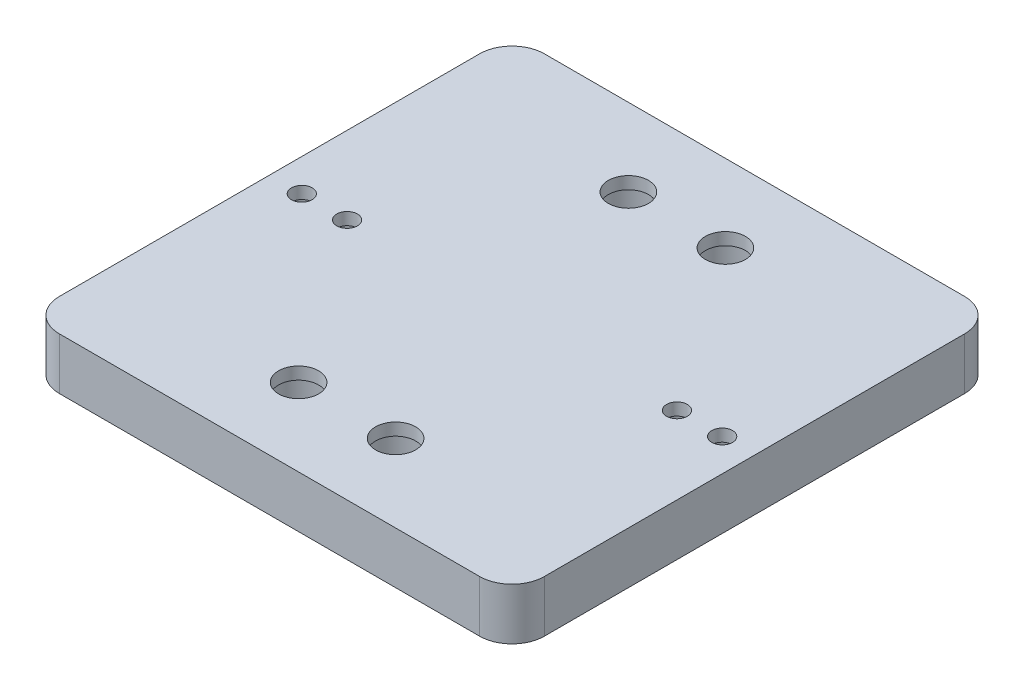
ISO-10303-21;
HEADER;
FILE_DESCRIPTION(('STEP AP214'),'2;1');
FILE_NAME('part.step','',(''),(''),'','','');
FILE_SCHEMA(('AUTOMOTIVE_DESIGN { 1 0 10303 214 1 1 1 1 }'));
ENDSEC;
DATA;
#1=APPLICATION_CONTEXT('core data for automotive mechanical design processes');
#2=APPLICATION_PROTOCOL_DEFINITION('international standard','automotive_design',2000,#1);
#3=PRODUCT_CONTEXT('',#1,'mechanical');
#4=PRODUCT('Part','Part','',(#3));
#5=PRODUCT_RELATED_PRODUCT_CATEGORY('part','',(#4));
#6=PRODUCT_DEFINITION_FORMATION('','',#4);
#7=PRODUCT_DEFINITION_CONTEXT('part definition',#1,'design');
#8=PRODUCT_DEFINITION('design','',#6,#7);
#9=PRODUCT_DEFINITION_SHAPE('','',#8);
#10=(LENGTH_UNIT() NAMED_UNIT(*) SI_UNIT(.MILLI.,.METRE.));
#11=(NAMED_UNIT(*) PLANE_ANGLE_UNIT() SI_UNIT($,.RADIAN.));
#12=(NAMED_UNIT(*) SI_UNIT($,.STERADIAN.) SOLID_ANGLE_UNIT());
#13=UNCERTAINTY_MEASURE_WITH_UNIT(LENGTH_MEASURE(1.E-05),#10,'distance_accuracy_value','');
#14=(GEOMETRIC_REPRESENTATION_CONTEXT(3) GLOBAL_UNCERTAINTY_ASSIGNED_CONTEXT((#13)) GLOBAL_UNIT_ASSIGNED_CONTEXT((#10,
#11,#12)) REPRESENTATION_CONTEXT('',''));
#15=CARTESIAN_POINT('',(0.,0.,0.));
#16=DIRECTION('',(0.,0.,1.));
#17=DIRECTION('',(1.,0.,0.));
#18=AXIS2_PLACEMENT_3D('',#15,#16,#17);
#19=CARTESIAN_POINT('',(-25.5,4.,0.));
#20=DIRECTION('',(0.,-1.,0.));
#21=DIRECTION('',(0.,0.,-1.));
#22=AXIS2_PLACEMENT_3D('',#19,#20,#21);
#23=CYLINDRICAL_SURFACE('',#22,1.6);
#24=CARTESIAN_POINT('',(-25.5,4.,0.));
#25=DIRECTION('',(0.,1.,0.));
#26=DIRECTION('',(0.,0.,-1.));
#27=AXIS2_PLACEMENT_3D('',#24,#25,#26);
#28=CIRCLE('',#27,1.6);
#29=CARTESIAN_POINT('',(-25.5,4.,-1.6));
#30=VERTEX_POINT('',#29);
#31=EDGE_CURVE('E192',#30,#30,#28,.T.);
#32=ORIENTED_EDGE('',*,*,#31,.T.);
#33=EDGE_LOOP('',(#32));
#34=FACE_BOUND('',#33,.T.);
#35=CARTESIAN_POINT('',(-25.5,2.1,0.));
#36=DIRECTION('',(0.,-1.,0.));
#37=DIRECTION('',(0.,0.,-1.));
#38=AXIS2_PLACEMENT_3D('',#35,#36,#37);
#39=CIRCLE('',#38,1.6);
#40=CARTESIAN_POINT('',(-25.5,2.1,-1.6));
#41=VERTEX_POINT('',#40);
#42=EDGE_CURVE('E141',#41,#41,#39,.T.);
#43=ORIENTED_EDGE('',*,*,#42,.T.);
#44=EDGE_LOOP('',(#43));
#45=FACE_BOUND('',#44,.T.);
#46=ADVANCED_FACE('F39',(#34,#45),#23,.F.);
#47=CARTESIAN_POINT('',(-32.5,4.,0.));
#48=DIRECTION('',(0.,-1.,0.));
#49=DIRECTION('',(0.,0.,-1.));
#50=AXIS2_PLACEMENT_3D('',#47,#48,#49);
#51=CYLINDRICAL_SURFACE('',#50,1.60000000000001);
#52=CARTESIAN_POINT('',(-32.5,4.,0.));
#53=DIRECTION('',(0.,1.,0.));
#54=DIRECTION('',(0.,0.,1.));
#55=AXIS2_PLACEMENT_3D('',#52,#53,#54);
#56=CIRCLE('',#55,1.60000000000001);
#57=CARTESIAN_POINT('',(-32.5,4.,1.6));
#58=VERTEX_POINT('',#57);
#59=EDGE_CURVE('E230',#58,#58,#56,.T.);
#60=ORIENTED_EDGE('',*,*,#59,.T.);
#61=EDGE_LOOP('',(#60));
#62=FACE_BOUND('',#61,.T.);
#63=CARTESIAN_POINT('',(-32.5,2.1,0.));
#64=DIRECTION('',(0.,-1.,0.));
#65=DIRECTION('',(0.,0.,-1.));
#66=AXIS2_PLACEMENT_3D('',#63,#64,#65);
#67=CIRCLE('',#66,1.60000000000001);
#68=CARTESIAN_POINT('',(-32.5,2.1,-1.60000000000001));
#69=VERTEX_POINT('',#68);
#70=EDGE_CURVE('E265',#69,#69,#67,.T.);
#71=ORIENTED_EDGE('',*,*,#70,.T.);
#72=EDGE_LOOP('',(#71));
#73=FACE_BOUND('',#72,.T.);
#74=ADVANCED_FACE('F373',(#62,#73),#51,.F.);
#75=CARTESIAN_POINT('',(7.50000000000001,4.,25.5));
#76=DIRECTION('',(0.,-1.,0.));
#77=DIRECTION('',(0.,0.,-1.));
#78=AXIS2_PLACEMENT_3D('',#75,#76,#77);
#79=CYLINDRICAL_SURFACE('',#78,3.09999999999999);
#80=CARTESIAN_POINT('',(7.50000000000001,4.,25.5));
#81=DIRECTION('',(0.,1.,0.));
#82=DIRECTION('',(0.,0.,-1.));
#83=AXIS2_PLACEMENT_3D('',#80,#81,#82);
#84=CIRCLE('',#83,3.09999999999999);
#85=CARTESIAN_POINT('',(7.50000000000001,4.,22.4));
#86=VERTEX_POINT('',#85);
#87=EDGE_CURVE('E214',#86,#86,#84,.T.);
#88=ORIENTED_EDGE('',*,*,#87,.T.);
#89=EDGE_LOOP('',(#88));
#90=FACE_BOUND('',#89,.T.);
#91=CARTESIAN_POINT('',(7.50000000000001,2.1,25.5));
#92=DIRECTION('',(0.,-1.,0.));
#93=DIRECTION('',(0.,0.,-1.));
#94=AXIS2_PLACEMENT_3D('',#91,#92,#93);
#95=CIRCLE('',#94,3.09999999999999);
#96=CARTESIAN_POINT('',(7.50000000000001,2.1,22.4));
#97=VERTEX_POINT('',#96);
#98=EDGE_CURVE('E250',#97,#97,#95,.T.);
#99=ORIENTED_EDGE('',*,*,#98,.T.);
#100=EDGE_LOOP('',(#99));
#101=FACE_BOUND('',#100,.T.);
#102=ADVANCED_FACE('F379',(#90,#101),#79,.F.);
#103=CARTESIAN_POINT('',(-7.49999999999999,4.,-25.5));
#104=DIRECTION('',(0.,-1.,0.));
#105=DIRECTION('',(0.,0.,-1.));
#106=AXIS2_PLACEMENT_3D('',#103,#104,#105);
#107=CYLINDRICAL_SURFACE('',#106,3.1);
#108=CARTESIAN_POINT('',(-7.49999999999999,4.,-25.5));
#109=DIRECTION('',(0.,1.,0.));
#110=DIRECTION('',(0.,0.,-1.));
#111=AXIS2_PLACEMENT_3D('',#108,#109,#110);
#112=CIRCLE('',#111,3.1);
#113=CARTESIAN_POINT('',(-7.49999999999999,4.,-28.6));
#114=VERTEX_POINT('',#113);
#115=EDGE_CURVE('E203',#114,#114,#112,.T.);
#116=ORIENTED_EDGE('',*,*,#115,.T.);
#117=EDGE_LOOP('',(#116));
#118=FACE_BOUND('',#117,.T.);
#119=CARTESIAN_POINT('',(-7.49999999999999,2.1,-25.5));
#120=DIRECTION('',(0.,-1.,0.));
#121=DIRECTION('',(0.,0.,-1.));
#122=AXIS2_PLACEMENT_3D('',#119,#120,#121);
#123=CIRCLE('',#122,3.1);
#124=CARTESIAN_POINT('',(-7.49999999999999,2.1,-28.6));
#125=VERTEX_POINT('',#124);
#126=EDGE_CURVE('E241',#125,#125,#123,.T.);
#127=ORIENTED_EDGE('',*,*,#126,.T.);
#128=EDGE_LOOP('',(#127));
#129=FACE_BOUND('',#128,.T.);
#130=ADVANCED_FACE('F386',(#118,#129),#107,.F.);
#131=CARTESIAN_POINT('',(0.,4.,0.));
#132=DIRECTION('',(0.,1.,0.));
#133=DIRECTION('',(0.,0.,1.));
#134=AXIS2_PLACEMENT_3D('',#131,#132,#133);
#135=PLANE('',#134);
#136=CARTESIAN_POINT('',(7.50000000000001,4.,-25.5));
#137=DIRECTION('',(0.,1.,0.));
#138=DIRECTION('',(0.,0.,1.));
#139=AXIS2_PLACEMENT_3D('',#136,#137,#138);
#140=CIRCLE('',#139,3.09999999999999);
#141=CARTESIAN_POINT('',(7.50000000000001,4.,-22.4));
#142=VERTEX_POINT('',#141);
#143=EDGE_CURVE('E210',#142,#142,#140,.T.);
#144=ORIENTED_EDGE('',*,*,#143,.F.);
#145=EDGE_LOOP('',(#144));
#146=FACE_BOUND('',#145,.T.);
#147=CARTESIAN_POINT('',(-7.49999999999999,4.,25.5));
#148=DIRECTION('',(0.,1.,0.));
#149=DIRECTION('',(0.,0.,1.));
#150=AXIS2_PLACEMENT_3D('',#147,#148,#149);
#151=CIRCLE('',#150,3.1);
#152=CARTESIAN_POINT('',(-7.49999999999999,4.,28.6));
#153=VERTEX_POINT('',#152);
#154=EDGE_CURVE('E218',#153,#153,#151,.T.);
#155=ORIENTED_EDGE('',*,*,#154,.F.);
#156=EDGE_LOOP('',(#155));
#157=FACE_BOUND('',#156,.T.);
#158=CARTESIAN_POINT('',(25.5,4.,0.));
#159=DIRECTION('',(0.,1.,0.));
#160=DIRECTION('',(0.,0.,1.));
#161=AXIS2_PLACEMENT_3D('',#158,#159,#160);
#162=CIRCLE('',#161,1.60000000000001);
#163=CARTESIAN_POINT('',(25.5,4.,1.6));
#164=VERTEX_POINT('',#163);
#165=EDGE_CURVE('E226',#164,#164,#162,.T.);
#166=ORIENTED_EDGE('',*,*,#165,.F.);
#167=EDGE_LOOP('',(#166));
#168=FACE_BOUND('',#167,.T.);
#169=ORIENTED_EDGE('',*,*,#31,.F.);
#170=EDGE_LOOP('',(#169));
#171=FACE_BOUND('',#170,.T.);
#172=DIRECTION('',(1.,0.,0.));
#173=VECTOR('',#172,1.);
#174=CARTESIAN_POINT('',(-37.5,4.,37.5));
#175=LINE('',#174,#173);
#176=CARTESIAN_POINT('',(-32.5,4.,37.5));
#177=VERTEX_POINT('',#176);
#178=CARTESIAN_POINT('',(32.5,4.,37.5));
#179=VERTEX_POINT('',#178);
#180=EDGE_CURVE('E191',#177,#179,#175,.T.);
#181=ORIENTED_EDGE('',*,*,#180,.T.);
#182=CARTESIAN_POINT('',(32.5,4.,32.5));
#183=DIRECTION('',(0.,1.,0.));
#184=DIRECTION('',(0.,0.,1.));
#185=AXIS2_PLACEMENT_3D('',#182,#183,#184);
#186=CIRCLE('',#185,5.);
#187=CARTESIAN_POINT('',(37.5,4.,32.5));
#188=VERTEX_POINT('',#187);
#189=EDGE_CURVE('E165',#179,#188,#186,.T.);
#190=ORIENTED_EDGE('',*,*,#189,.T.);
#191=DIRECTION('',(0.,0.,-1.));
#192=VECTOR('',#191,1.);
#193=CARTESIAN_POINT('',(37.5,4.,-37.5));
#194=LINE('',#193,#192);
#195=CARTESIAN_POINT('',(37.5,4.,-32.5));
#196=VERTEX_POINT('',#195);
#197=EDGE_CURVE('E138',#188,#196,#194,.T.);
#198=ORIENTED_EDGE('',*,*,#197,.T.);
#199=CARTESIAN_POINT('',(32.5,4.,-32.5));
#200=DIRECTION('',(0.,1.,0.));
#201=DIRECTION('',(0.,0.,1.));
#202=AXIS2_PLACEMENT_3D('',#199,#200,#201);
#203=CIRCLE('',#202,5.);
#204=CARTESIAN_POINT('',(32.5,4.,-37.5));
#205=VERTEX_POINT('',#204);
#206=EDGE_CURVE('E62',#196,#205,#203,.T.);
#207=ORIENTED_EDGE('',*,*,#206,.T.);
#208=DIRECTION('',(-1.,0.,0.));
#209=VECTOR('',#208,1.);
#210=CARTESIAN_POINT('',(-37.5,4.,-37.5));
#211=LINE('',#210,#209);
#212=CARTESIAN_POINT('',(-32.5,4.,-37.5));
#213=VERTEX_POINT('',#212);
#214=EDGE_CURVE('E132',#205,#213,#211,.T.);
#215=ORIENTED_EDGE('',*,*,#214,.T.);
#216=CARTESIAN_POINT('',(-32.5,4.,-32.5));
#217=DIRECTION('',(0.,1.,0.));
#218=DIRECTION('',(0.,0.,1.));
#219=AXIS2_PLACEMENT_3D('',#216,#217,#218);
#220=CIRCLE('',#219,5.);
#221=CARTESIAN_POINT('',(-37.5,4.,-32.5));
#222=VERTEX_POINT('',#221);
#223=EDGE_CURVE('E160',#213,#222,#220,.T.);
#224=ORIENTED_EDGE('',*,*,#223,.T.);
#225=DIRECTION('',(0.,0.,1.));
#226=VECTOR('',#225,1.);
#227=CARTESIAN_POINT('',(-37.5,4.,-37.5));
#228=LINE('',#227,#226);
#229=CARTESIAN_POINT('',(-37.5,4.,32.5));
#230=VERTEX_POINT('',#229);
#231=EDGE_CURVE('E179',#222,#230,#228,.T.);
#232=ORIENTED_EDGE('',*,*,#231,.T.);
#233=CARTESIAN_POINT('',(-32.5,4.,32.5));
#234=DIRECTION('',(0.,1.,0.));
#235=DIRECTION('',(0.,0.,1.));
#236=AXIS2_PLACEMENT_3D('',#233,#234,#235);
#237=CIRCLE('',#236,5.);
#238=EDGE_CURVE('E157',#230,#177,#237,.T.);
#239=ORIENTED_EDGE('',*,*,#238,.T.);
#240=EDGE_LOOP('',(#181,#190,#198,#207,#215,#224,#232,#239));
#241=FACE_BOUND('',#240,.T.);
#242=ORIENTED_EDGE('',*,*,#59,.F.);
#243=EDGE_LOOP('',(#242));
#244=FACE_BOUND('',#243,.T.);
#245=CARTESIAN_POINT('',(32.5,4.,0.));
#246=DIRECTION('',(0.,1.,0.));
#247=DIRECTION('',(0.,0.,-1.));
#248=AXIS2_PLACEMENT_3D('',#245,#246,#247);
#249=CIRCLE('',#248,1.6);
#250=CARTESIAN_POINT('',(32.5,4.,-1.60000000000001));
#251=VERTEX_POINT('',#250);
#252=EDGE_CURVE('E222',#251,#251,#249,.T.);
#253=ORIENTED_EDGE('',*,*,#252,.F.);
#254=EDGE_LOOP('',(#253));
#255=FACE_BOUND('',#254,.T.);
#256=ORIENTED_EDGE('',*,*,#87,.F.);
#257=EDGE_LOOP('',(#256));
#258=FACE_BOUND('',#257,.T.);
#259=ORIENTED_EDGE('',*,*,#115,.F.);
#260=EDGE_LOOP('',(#259));
#261=FACE_BOUND('',#260,.T.);
#262=ADVANCED_FACE('F186',(#146,#157,#168,#171,#241,#244,#255,#258,#261),#135,.T.);
#263=CARTESIAN_POINT('',(-37.5,4.,-37.5));
#264=DIRECTION('',(1.,0.,0.));
#265=DIRECTION('',(0.,0.,-1.));
#266=AXIS2_PLACEMENT_3D('',#263,#264,#265);
#267=PLANE('',#266);
#268=ORIENTED_EDGE('',*,*,#231,.F.);
#269=DIRECTION('',(0.,-1.,0.));
#270=VECTOR('',#269,1.);
#271=CARTESIAN_POINT('',(-37.5,4.,-32.5));
#272=LINE('',#271,#270);
#273=CARTESIAN_POINT('',(-37.5,-4.,-32.5));
#274=VERTEX_POINT('',#273);
#275=EDGE_CURVE('E11',#222,#274,#272,.T.);
#276=ORIENTED_EDGE('',*,*,#275,.T.);
#277=DIRECTION('',(0.,0.,-1.));
#278=VECTOR('',#277,1.);
#279=CARTESIAN_POINT('',(-37.5,-4.,-37.5));
#280=LINE('',#279,#278);
#281=CARTESIAN_POINT('',(-37.5,-4.,32.5));
#282=VERTEX_POINT('',#281);
#283=EDGE_CURVE('E182',#282,#274,#280,.T.);
#284=ORIENTED_EDGE('',*,*,#283,.F.);
#285=DIRECTION('',(0.,-1.,0.));
#286=VECTOR('',#285,1.);
#287=CARTESIAN_POINT('',(-37.5,4.,32.5));
#288=LINE('',#287,#286);
#289=EDGE_CURVE('E48',#282,#230,#288,.F.);
#290=ORIENTED_EDGE('',*,*,#289,.T.);
#291=EDGE_LOOP('',(#268,#276,#284,#290));
#292=FACE_BOUND('',#291,.T.);
#293=ADVANCED_FACE('F178',(#292),#267,.F.);
#294=CARTESIAN_POINT('',(-37.5,4.,37.5));
#295=DIRECTION('',(0.,0.,-1.));
#296=DIRECTION('',(-1.,0.,0.));
#297=AXIS2_PLACEMENT_3D('',#294,#295,#296);
#298=PLANE('',#297);
#299=DIRECTION('',(-1.,0.,0.));
#300=VECTOR('',#299,1.);
#301=CARTESIAN_POINT('',(-37.5,-4.,37.5));
#302=LINE('',#301,#300);
#303=CARTESIAN_POINT('',(32.5,-4.,37.5));
#304=VERTEX_POINT('',#303);
#305=CARTESIAN_POINT('',(-32.5,-4.,37.5));
#306=VERTEX_POINT('',#305);
#307=EDGE_CURVE('E128',#304,#306,#302,.T.);
#308=ORIENTED_EDGE('',*,*,#307,.F.);
#309=DIRECTION('',(0.,-1.,0.));
#310=VECTOR('',#309,1.);
#311=CARTESIAN_POINT('',(32.5,4.,37.5));
#312=LINE('',#311,#310);
#313=EDGE_CURVE('E154',#304,#179,#312,.F.);
#314=ORIENTED_EDGE('',*,*,#313,.T.);
#315=ORIENTED_EDGE('',*,*,#180,.F.);
#316=DIRECTION('',(0.,-1.,0.));
#317=VECTOR('',#316,1.);
#318=CARTESIAN_POINT('',(-32.5,4.,37.5));
#319=LINE('',#318,#317);
#320=EDGE_CURVE('E150',#177,#306,#319,.T.);
#321=ORIENTED_EDGE('',*,*,#320,.T.);
#322=EDGE_LOOP('',(#308,#314,#315,#321));
#323=FACE_BOUND('',#322,.T.);
#324=ADVANCED_FACE('F198',(#323),#298,.F.);
#325=CARTESIAN_POINT('',(37.5,4.,-37.5));
#326=DIRECTION('',(-1.,0.,0.));
#327=DIRECTION('',(0.,0.,1.));
#328=AXIS2_PLACEMENT_3D('',#325,#326,#327);
#329=PLANE('',#328);
#330=ORIENTED_EDGE('',*,*,#197,.F.);
#331=DIRECTION('',(0.,-1.,0.));
#332=VECTOR('',#331,1.);
#333=CARTESIAN_POINT('',(37.5,4.,32.5));
#334=LINE('',#333,#332);
#335=CARTESIAN_POINT('',(37.5,-4.,32.5));
#336=VERTEX_POINT('',#335);
#337=EDGE_CURVE('E126',#188,#336,#334,.T.);
#338=ORIENTED_EDGE('',*,*,#337,.T.);
#339=DIRECTION('',(0.,0.,1.));
#340=VECTOR('',#339,1.);
#341=CARTESIAN_POINT('',(37.5,-4.,37.5));
#342=LINE('',#341,#340);
#343=CARTESIAN_POINT('',(37.5,-4.,-32.5));
#344=VERTEX_POINT('',#343);
#345=EDGE_CURVE('E110',#344,#336,#342,.T.);
#346=ORIENTED_EDGE('',*,*,#345,.F.);
#347=DIRECTION('',(0.,-1.,0.));
#348=VECTOR('',#347,1.);
#349=CARTESIAN_POINT('',(37.5,4.,-32.5));
#350=LINE('',#349,#348);
#351=EDGE_CURVE('E124',#344,#196,#350,.F.);
#352=ORIENTED_EDGE('',*,*,#351,.T.);
#353=EDGE_LOOP('',(#330,#338,#346,#352));
#354=FACE_BOUND('',#353,.T.);
#355=ADVANCED_FACE('F123',(#354),#329,.F.);
#356=CARTESIAN_POINT('',(-37.5,4.,-37.5));
#357=DIRECTION('',(0.,0.,1.));
#358=DIRECTION('',(1.,0.,0.));
#359=AXIS2_PLACEMENT_3D('',#356,#357,#358);
#360=PLANE('',#359);
#361=ORIENTED_EDGE('',*,*,#214,.F.);
#362=DIRECTION('',(0.,-1.,0.));
#363=VECTOR('',#362,1.);
#364=CARTESIAN_POINT('',(32.5,4.,-37.5));
#365=LINE('',#364,#363);
#366=CARTESIAN_POINT('',(32.5,-4.,-37.5));
#367=VERTEX_POINT('',#366);
#368=EDGE_CURVE('E170',#205,#367,#365,.T.);
#369=ORIENTED_EDGE('',*,*,#368,.T.);
#370=DIRECTION('',(1.,0.,0.));
#371=VECTOR('',#370,1.);
#372=CARTESIAN_POINT('',(37.5,-4.,-37.5));
#373=LINE('',#372,#371);
#374=CARTESIAN_POINT('',(-32.5,-4.,-37.5));
#375=VERTEX_POINT('',#374);
#376=EDGE_CURVE('E111',#375,#367,#373,.T.);
#377=ORIENTED_EDGE('',*,*,#376,.F.);
#378=DIRECTION('',(0.,-1.,0.));
#379=VECTOR('',#378,1.);
#380=CARTESIAN_POINT('',(-32.5,4.,-37.5));
#381=LINE('',#380,#379);
#382=EDGE_CURVE('E55',#375,#213,#381,.F.);
#383=ORIENTED_EDGE('',*,*,#382,.T.);
#384=EDGE_LOOP('',(#361,#369,#377,#383));
#385=FACE_BOUND('',#384,.T.);
#386=ADVANCED_FACE('F388',(#385),#360,.F.);
#387=CARTESIAN_POINT('',(25.5,4.,0.));
#388=DIRECTION('',(0.,-1.,0.));
#389=DIRECTION('',(0.,0.,-1.));
#390=AXIS2_PLACEMENT_3D('',#387,#388,#389);
#391=CYLINDRICAL_SURFACE('',#390,1.60000000000001);
#392=CARTESIAN_POINT('',(25.5,2.1,0.));
#393=DIRECTION('',(0.,1.,0.));
#394=DIRECTION('',(0.,0.,1.));
#395=AXIS2_PLACEMENT_3D('',#392,#393,#394);
#396=CIRCLE('',#395,1.60000000000001);
#397=CARTESIAN_POINT('',(25.5,2.1,1.6));
#398=VERTEX_POINT('',#397);
#399=EDGE_CURVE('E262',#398,#398,#396,.T.);
#400=ORIENTED_EDGE('',*,*,#399,.F.);
#401=EDGE_LOOP('',(#400));
#402=FACE_BOUND('',#401,.T.);
#403=ORIENTED_EDGE('',*,*,#165,.T.);
#404=EDGE_LOOP('',(#403));
#405=FACE_BOUND('',#404,.T.);
#406=ADVANCED_FACE('F391',(#402,#405),#391,.F.);
#407=CARTESIAN_POINT('',(32.5,4.,0.));
#408=DIRECTION('',(0.,-1.,0.));
#409=DIRECTION('',(0.,0.,-1.));
#410=AXIS2_PLACEMENT_3D('',#407,#408,#409);
#411=CYLINDRICAL_SURFACE('',#410,1.6);
#412=CARTESIAN_POINT('',(32.5,2.1,0.));
#413=DIRECTION('',(0.,1.,0.));
#414=DIRECTION('',(0.,0.,1.));
#415=AXIS2_PLACEMENT_3D('',#412,#413,#414);
#416=CIRCLE('',#415,1.6);
#417=CARTESIAN_POINT('',(32.5,2.1,1.59999999999999));
#418=VERTEX_POINT('',#417);
#419=EDGE_CURVE('E258',#418,#418,#416,.T.);
#420=ORIENTED_EDGE('',*,*,#419,.F.);
#421=EDGE_LOOP('',(#420));
#422=FACE_BOUND('',#421,.T.);
#423=ORIENTED_EDGE('',*,*,#252,.T.);
#424=EDGE_LOOP('',(#423));
#425=FACE_BOUND('',#424,.T.);
#426=ADVANCED_FACE('F635',(#422,#425),#411,.F.);
#427=CARTESIAN_POINT('',(-7.49999999999999,4.,25.5));
#428=DIRECTION('',(0.,-1.,0.));
#429=DIRECTION('',(0.,0.,-1.));
#430=AXIS2_PLACEMENT_3D('',#427,#428,#429);
#431=CYLINDRICAL_SURFACE('',#430,3.1);
#432=CARTESIAN_POINT('',(-7.49999999999999,2.1,25.5));
#433=DIRECTION('',(0.,1.,0.));
#434=DIRECTION('',(0.,0.,1.));
#435=AXIS2_PLACEMENT_3D('',#432,#433,#434);
#436=CIRCLE('',#435,3.1);
#437=CARTESIAN_POINT('',(-7.49999999999999,2.1,28.6));
#438=VERTEX_POINT('',#437);
#439=EDGE_CURVE('E254',#438,#438,#436,.T.);
#440=ORIENTED_EDGE('',*,*,#439,.F.);
#441=EDGE_LOOP('',(#440));
#442=FACE_BOUND('',#441,.T.);
#443=ORIENTED_EDGE('',*,*,#154,.T.);
#444=EDGE_LOOP('',(#443));
#445=FACE_BOUND('',#444,.T.);
#446=ADVANCED_FACE('F625',(#442,#445),#431,.F.);
#447=CARTESIAN_POINT('',(7.50000000000001,4.,-25.5));
#448=DIRECTION('',(0.,-1.,0.));
#449=DIRECTION('',(0.,0.,-1.));
#450=AXIS2_PLACEMENT_3D('',#447,#448,#449);
#451=CYLINDRICAL_SURFACE('',#450,3.09999999999999);
#452=CARTESIAN_POINT('',(7.50000000000001,2.1,-25.5));
#453=DIRECTION('',(0.,1.,0.));
#454=DIRECTION('',(0.,0.,1.));
#455=AXIS2_PLACEMENT_3D('',#452,#453,#454);
#456=CIRCLE('',#455,3.09999999999999);
#457=CARTESIAN_POINT('',(7.50000000000001,2.1,-22.4));
#458=VERTEX_POINT('',#457);
#459=EDGE_CURVE('E245',#458,#458,#456,.T.);
#460=ORIENTED_EDGE('',*,*,#459,.F.);
#461=EDGE_LOOP('',(#460));
#462=FACE_BOUND('',#461,.T.);
#463=ORIENTED_EDGE('',*,*,#143,.T.);
#464=EDGE_LOOP('',(#463));
#465=FACE_BOUND('',#464,.T.);
#466=ADVANCED_FACE('F352',(#462,#465),#451,.F.);
#467=CARTESIAN_POINT('',(0.,-4.,0.));
#468=DIRECTION('',(0.,1.,0.));
#469=DIRECTION('',(0.,0.,1.));
#470=AXIS2_PLACEMENT_3D('',#467,#468,#469);
#471=PLANE('',#470);
#472=CARTESIAN_POINT('',(7.49999999999998,-4.,-25.5));
#473=DIRECTION('',(0.,-1.,0.));
#474=DIRECTION('',(0.,0.,1.));
#475=AXIS2_PLACEMENT_3D('',#472,#473,#474);
#476=CIRCLE('',#475,5.05);
#477=CARTESIAN_POINT('',(7.49999999999998,-4.,-20.45));
#478=VERTEX_POINT('',#477);
#479=EDGE_CURVE('E309',#478,#478,#476,.T.);
#480=ORIENTED_EDGE('',*,*,#479,.F.);
#481=EDGE_LOOP('',(#480));
#482=FACE_BOUND('',#481,.T.);
#483=CARTESIAN_POINT('',(7.49999999999998,-4.,25.5));
#484=DIRECTION('',(0.,-1.,0.));
#485=DIRECTION('',(0.,0.,-1.));
#486=AXIS2_PLACEMENT_3D('',#483,#484,#485);
#487=CIRCLE('',#486,5.05);
#488=CARTESIAN_POINT('',(7.49999999999998,-4.,20.45));
#489=VERTEX_POINT('',#488);
#490=EDGE_CURVE('E301',#489,#489,#487,.T.);
#491=ORIENTED_EDGE('',*,*,#490,.F.);
#492=EDGE_LOOP('',(#491));
#493=FACE_BOUND('',#492,.T.);
#494=CARTESIAN_POINT('',(-7.49999999999998,-4.,25.5));
#495=DIRECTION('',(0.,-1.,0.));
#496=DIRECTION('',(0.,0.,1.));
#497=AXIS2_PLACEMENT_3D('',#494,#495,#496);
#498=CIRCLE('',#497,5.04999999999999);
#499=CARTESIAN_POINT('',(-7.49999999999998,-4.,30.55));
#500=VERTEX_POINT('',#499);
#501=EDGE_CURVE('E293',#500,#500,#498,.T.);
#502=ORIENTED_EDGE('',*,*,#501,.F.);
#503=EDGE_LOOP('',(#502));
#504=FACE_BOUND('',#503,.T.);
#505=CARTESIAN_POINT('',(-32.5,-4.,0.));
#506=DIRECTION('',(0.,-1.,0.));
#507=DIRECTION('',(0.,0.,-1.));
#508=AXIS2_PLACEMENT_3D('',#505,#506,#507);
#509=CIRCLE('',#508,2.95);
#510=CARTESIAN_POINT('',(-32.5,-4.,-2.95));
#511=VERTEX_POINT('',#510);
#512=EDGE_CURVE('E284',#511,#511,#509,.T.);
#513=ORIENTED_EDGE('',*,*,#512,.F.);
#514=EDGE_LOOP('',(#513));
#515=FACE_BOUND('',#514,.T.);
#516=CARTESIAN_POINT('',(-25.5,-4.,0.));
#517=DIRECTION('',(0.,-1.,0.));
#518=DIRECTION('',(0.,0.,-1.));
#519=AXIS2_PLACEMENT_3D('',#516,#517,#518);
#520=CIRCLE('',#519,2.95);
#521=CARTESIAN_POINT('',(-25.5,-4.,-2.95));
#522=VERTEX_POINT('',#521);
#523=EDGE_CURVE('E332',#522,#522,#520,.T.);
#524=ORIENTED_EDGE('',*,*,#523,.F.);
#525=EDGE_LOOP('',(#524));
#526=FACE_BOUND('',#525,.T.);
#527=CARTESIAN_POINT('',(25.5,-4.,0.));
#528=DIRECTION('',(0.,-1.,0.));
#529=DIRECTION('',(0.,0.,1.));
#530=AXIS2_PLACEMENT_3D('',#527,#528,#529);
#531=CIRCLE('',#530,2.95);
#532=CARTESIAN_POINT('',(25.5,-4.,2.95));
#533=VERTEX_POINT('',#532);
#534=EDGE_CURVE('E324',#533,#533,#531,.T.);
#535=ORIENTED_EDGE('',*,*,#534,.F.);
#536=EDGE_LOOP('',(#535));
#537=FACE_BOUND('',#536,.T.);
#538=CARTESIAN_POINT('',(32.5,-4.,0.));
#539=DIRECTION('',(0.,-1.,0.));
#540=DIRECTION('',(0.,0.,1.));
#541=AXIS2_PLACEMENT_3D('',#538,#539,#540);
#542=CIRCLE('',#541,2.95000000000001);
#543=CARTESIAN_POINT('',(32.5,-4.,2.95000000000001));
#544=VERTEX_POINT('',#543);
#545=EDGE_CURVE('E316',#544,#544,#542,.T.);
#546=ORIENTED_EDGE('',*,*,#545,.F.);
#547=EDGE_LOOP('',(#546));
#548=FACE_BOUND('',#547,.T.);
#549=CARTESIAN_POINT('',(-7.49999999999999,-4.,-25.5));
#550=DIRECTION('',(0.,-1.,0.));
#551=DIRECTION('',(0.,0.,-1.));
#552=AXIS2_PLACEMENT_3D('',#549,#550,#551);
#553=CIRCLE('',#552,5.05);
#554=CARTESIAN_POINT('',(-7.49999999999999,-4.,-30.55));
#555=VERTEX_POINT('',#554);
#556=EDGE_CURVE('E276',#555,#555,#553,.T.);
#557=ORIENTED_EDGE('',*,*,#556,.F.);
#558=EDGE_LOOP('',(#557));
#559=FACE_BOUND('',#558,.T.);
#560=ORIENTED_EDGE('',*,*,#345,.T.);
#561=CARTESIAN_POINT('',(32.5,-4.,32.5));
#562=DIRECTION('',(0.,1.,0.));
#563=DIRECTION('',(0.,0.,1.));
#564=AXIS2_PLACEMENT_3D('',#561,#562,#563);
#565=CIRCLE('',#564,5.);
#566=EDGE_CURVE('E117',#336,#304,#565,.F.);
#567=ORIENTED_EDGE('',*,*,#566,.T.);
#568=ORIENTED_EDGE('',*,*,#307,.T.);
#569=CARTESIAN_POINT('',(-32.5,-4.,32.5));
#570=DIRECTION('',(0.,1.,0.));
#571=DIRECTION('',(0.,0.,1.));
#572=AXIS2_PLACEMENT_3D('',#569,#570,#571);
#573=CIRCLE('',#572,5.);
#574=EDGE_CURVE('E136',#306,#282,#573,.F.);
#575=ORIENTED_EDGE('',*,*,#574,.T.);
#576=ORIENTED_EDGE('',*,*,#283,.T.);
#577=CARTESIAN_POINT('',(-32.5,-4.,-32.5));
#578=DIRECTION('',(0.,1.,0.));
#579=DIRECTION('',(0.,0.,1.));
#580=AXIS2_PLACEMENT_3D('',#577,#578,#579);
#581=CIRCLE('',#580,5.);
#582=EDGE_CURVE('E118',#274,#375,#581,.F.);
#583=ORIENTED_EDGE('',*,*,#582,.T.);
#584=ORIENTED_EDGE('',*,*,#376,.T.);
#585=CARTESIAN_POINT('',(32.5,-4.,-32.5));
#586=DIRECTION('',(0.,1.,0.));
#587=DIRECTION('',(0.,0.,1.));
#588=AXIS2_PLACEMENT_3D('',#585,#586,#587);
#589=CIRCLE('',#588,5.);
#590=EDGE_CURVE('E107',#367,#344,#589,.F.);
#591=ORIENTED_EDGE('',*,*,#590,.T.);
#592=EDGE_LOOP('',(#560,#567,#568,#575,#576,#583,#584,#591));
#593=FACE_BOUND('',#592,.T.);
#594=ADVANCED_FACE('F109',(#482,#493,#504,#515,#526,#537,#548,#559,#593),#471,.F.);
#595=CARTESIAN_POINT('',(-7.49999999999999,2.1,-25.5));
#596=DIRECTION('',(0.,-1.,0.));
#597=DIRECTION('',(0.,0.,-1.));
#598=AXIS2_PLACEMENT_3D('',#595,#596,#597);
#599=CYLINDRICAL_SURFACE('',#598,5.05);
#600=CARTESIAN_POINT('',(-7.49999999999999,2.1,-25.5));
#601=DIRECTION('',(0.,-1.,0.));
#602=DIRECTION('',(0.,0.,-1.));
#603=AXIS2_PLACEMENT_3D('',#600,#601,#602);
#604=CIRCLE('',#603,5.05);
#605=CARTESIAN_POINT('',(-7.49999999999999,2.1,-30.55));
#606=VERTEX_POINT('',#605);
#607=EDGE_CURVE('E246',#606,#606,#604,.T.);
#608=ORIENTED_EDGE('',*,*,#607,.F.);
#609=EDGE_LOOP('',(#608));
#610=FACE_BOUND('',#609,.T.);
#611=ORIENTED_EDGE('',*,*,#556,.T.);
#612=EDGE_LOOP('',(#611));
#613=FACE_BOUND('',#612,.T.);
#614=ADVANCED_FACE('F351',(#610,#613),#599,.F.);
#615=CARTESIAN_POINT('',(-7.49999999999999,2.1,-25.5));
#616=DIRECTION('',(0.,-1.,0.));
#617=DIRECTION('',(0.,0.,-1.));
#618=AXIS2_PLACEMENT_3D('',#615,#616,#617);
#619=PLANE('',#618);
#620=ORIENTED_EDGE('',*,*,#126,.F.);
#621=EDGE_LOOP('',(#620));
#622=FACE_BOUND('',#621,.T.);
#623=ORIENTED_EDGE('',*,*,#607,.T.);
#624=EDGE_LOOP('',(#623));
#625=FACE_BOUND('',#624,.T.);
#626=ADVANCED_FACE('F362',(#622,#625),#619,.T.);
#627=CARTESIAN_POINT('',(32.5,2.1,0.));
#628=DIRECTION('',(0.,-1.,0.));
#629=DIRECTION('',(0.,0.,-1.));
#630=AXIS2_PLACEMENT_3D('',#627,#628,#629);
#631=CYLINDRICAL_SURFACE('',#630,2.95000000000001);
#632=CARTESIAN_POINT('',(32.5,2.1,0.));
#633=DIRECTION('',(0.,-1.,0.));
#634=DIRECTION('',(0.,0.,1.));
#635=AXIS2_PLACEMENT_3D('',#632,#633,#634);
#636=CIRCLE('',#635,2.95000000000001);
#637=CARTESIAN_POINT('',(32.5,2.1,2.95000000000001));
#638=VERTEX_POINT('',#637);
#639=EDGE_CURVE('E320',#638,#638,#636,.T.);
#640=ORIENTED_EDGE('',*,*,#639,.F.);
#641=EDGE_LOOP('',(#640));
#642=FACE_BOUND('',#641,.T.);
#643=ORIENTED_EDGE('',*,*,#545,.T.);
#644=EDGE_LOOP('',(#643));
#645=FACE_BOUND('',#644,.T.);
#646=ADVANCED_FACE('F368',(#642,#645),#631,.F.);
#647=CARTESIAN_POINT('',(32.5,2.1,0.));
#648=DIRECTION('',(0.,1.,0.));
#649=DIRECTION('',(0.,0.,1.));
#650=AXIS2_PLACEMENT_3D('',#647,#648,#649);
#651=PLANE('',#650);
#652=ORIENTED_EDGE('',*,*,#419,.T.);
#653=EDGE_LOOP('',(#652));
#654=FACE_BOUND('',#653,.T.);
#655=ORIENTED_EDGE('',*,*,#639,.T.);
#656=EDGE_LOOP('',(#655));
#657=FACE_BOUND('',#656,.T.);
#658=ADVANCED_FACE('F588',(#654,#657),#651,.F.);
#659=CARTESIAN_POINT('',(25.5,2.1,0.));
#660=DIRECTION('',(0.,-1.,0.));
#661=DIRECTION('',(0.,0.,-1.));
#662=AXIS2_PLACEMENT_3D('',#659,#660,#661);
#663=CYLINDRICAL_SURFACE('',#662,2.95);
#664=CARTESIAN_POINT('',(25.5,2.1,0.));
#665=DIRECTION('',(0.,-1.,0.));
#666=DIRECTION('',(0.,0.,1.));
#667=AXIS2_PLACEMENT_3D('',#664,#665,#666);
#668=CIRCLE('',#667,2.95);
#669=CARTESIAN_POINT('',(25.5,2.1,2.95));
#670=VERTEX_POINT('',#669);
#671=EDGE_CURVE('E328',#670,#670,#668,.T.);
#672=ORIENTED_EDGE('',*,*,#671,.F.);
#673=EDGE_LOOP('',(#672));
#674=FACE_BOUND('',#673,.T.);
#675=ORIENTED_EDGE('',*,*,#534,.T.);
#676=EDGE_LOOP('',(#675));
#677=FACE_BOUND('',#676,.T.);
#678=ADVANCED_FACE('F578',(#674,#677),#663,.F.);
#679=CARTESIAN_POINT('',(25.5,2.1,0.));
#680=DIRECTION('',(0.,1.,0.));
#681=DIRECTION('',(0.,0.,1.));
#682=AXIS2_PLACEMENT_3D('',#679,#680,#681);
#683=PLANE('',#682);
#684=ORIENTED_EDGE('',*,*,#399,.T.);
#685=EDGE_LOOP('',(#684));
#686=FACE_BOUND('',#685,.T.);
#687=ORIENTED_EDGE('',*,*,#671,.T.);
#688=EDGE_LOOP('',(#687));
#689=FACE_BOUND('',#688,.T.);
#690=ADVANCED_FACE('F345',(#686,#689),#683,.F.);
#691=CARTESIAN_POINT('',(-25.5,2.1,0.));
#692=DIRECTION('',(0.,-1.,0.));
#693=DIRECTION('',(0.,0.,-1.));
#694=AXIS2_PLACEMENT_3D('',#691,#692,#693);
#695=CYLINDRICAL_SURFACE('',#694,2.95);
#696=CARTESIAN_POINT('',(-25.5,2.1,0.));
#697=DIRECTION('',(0.,-1.,0.));
#698=DIRECTION('',(0.,0.,-1.));
#699=AXIS2_PLACEMENT_3D('',#696,#697,#698);
#700=CIRCLE('',#699,2.95);
#701=CARTESIAN_POINT('',(-25.5,2.1,-2.95));
#702=VERTEX_POINT('',#701);
#703=EDGE_CURVE('E289',#702,#702,#700,.T.);
#704=ORIENTED_EDGE('',*,*,#703,.F.);
#705=EDGE_LOOP('',(#704));
#706=FACE_BOUND('',#705,.T.);
#707=ORIENTED_EDGE('',*,*,#523,.T.);
#708=EDGE_LOOP('',(#707));
#709=FACE_BOUND('',#708,.T.);
#710=ADVANCED_FACE('F342',(#706,#709),#695,.F.);
#711=CARTESIAN_POINT('',(-25.5,2.1,0.));
#712=DIRECTION('',(0.,-1.,0.));
#713=DIRECTION('',(0.,0.,-1.));
#714=AXIS2_PLACEMENT_3D('',#711,#712,#713);
#715=PLANE('',#714);
#716=ORIENTED_EDGE('',*,*,#42,.F.);
#717=EDGE_LOOP('',(#716));
#718=FACE_BOUND('',#717,.T.);
#719=ORIENTED_EDGE('',*,*,#703,.T.);
#720=EDGE_LOOP('',(#719));
#721=FACE_BOUND('',#720,.T.);
#722=ADVANCED_FACE('F340',(#718,#721),#715,.T.);
#723=CARTESIAN_POINT('',(-32.5,2.1,0.));
#724=DIRECTION('',(0.,-1.,0.));
#725=DIRECTION('',(0.,0.,-1.));
#726=AXIS2_PLACEMENT_3D('',#723,#724,#725);
#727=CYLINDRICAL_SURFACE('',#726,2.95);
#728=CARTESIAN_POINT('',(-32.5,2.1,0.));
#729=DIRECTION('',(0.,-1.,0.));
#730=DIRECTION('',(0.,0.,-1.));
#731=AXIS2_PLACEMENT_3D('',#728,#729,#730);
#732=CIRCLE('',#731,2.95);
#733=CARTESIAN_POINT('',(-32.5,2.1,-2.95));
#734=VERTEX_POINT('',#733);
#735=EDGE_CURVE('E288',#734,#734,#732,.T.);
#736=ORIENTED_EDGE('',*,*,#735,.F.);
#737=EDGE_LOOP('',(#736));
#738=FACE_BOUND('',#737,.T.);
#739=ORIENTED_EDGE('',*,*,#512,.T.);
#740=EDGE_LOOP('',(#739));
#741=FACE_BOUND('',#740,.T.);
#742=ADVANCED_FACE('F544',(#738,#741),#727,.F.);
#743=CARTESIAN_POINT('',(-32.5,2.1,0.));
#744=DIRECTION('',(0.,-1.,0.));
#745=DIRECTION('',(0.,0.,-1.));
#746=AXIS2_PLACEMENT_3D('',#743,#744,#745);
#747=PLANE('',#746);
#748=ORIENTED_EDGE('',*,*,#70,.F.);
#749=EDGE_LOOP('',(#748));
#750=FACE_BOUND('',#749,.T.);
#751=ORIENTED_EDGE('',*,*,#735,.T.);
#752=EDGE_LOOP('',(#751));
#753=FACE_BOUND('',#752,.T.);
#754=ADVANCED_FACE('F534',(#750,#753),#747,.T.);
#755=CARTESIAN_POINT('',(-7.49999999999998,2.1,25.5));
#756=DIRECTION('',(0.,-1.,0.));
#757=DIRECTION('',(0.,0.,-1.));
#758=AXIS2_PLACEMENT_3D('',#755,#756,#757);
#759=CYLINDRICAL_SURFACE('',#758,5.04999999999999);
#760=CARTESIAN_POINT('',(-7.49999999999998,2.1,25.5));
#761=DIRECTION('',(0.,-1.,0.));
#762=DIRECTION('',(0.,0.,1.));
#763=AXIS2_PLACEMENT_3D('',#760,#761,#762);
#764=CIRCLE('',#763,5.04999999999999);
#765=CARTESIAN_POINT('',(-7.49999999999998,2.1,30.55));
#766=VERTEX_POINT('',#765);
#767=EDGE_CURVE('E297',#766,#766,#764,.T.);
#768=ORIENTED_EDGE('',*,*,#767,.F.);
#769=EDGE_LOOP('',(#768));
#770=FACE_BOUND('',#769,.T.);
#771=ORIENTED_EDGE('',*,*,#501,.T.);
#772=EDGE_LOOP('',(#771));
#773=FACE_BOUND('',#772,.T.);
#774=ADVANCED_FACE('F524',(#770,#773),#759,.F.);
#775=CARTESIAN_POINT('',(-7.49999999999998,2.1,25.5));
#776=DIRECTION('',(0.,1.,0.));
#777=DIRECTION('',(0.,0.,1.));
#778=AXIS2_PLACEMENT_3D('',#775,#776,#777);
#779=PLANE('',#778);
#780=ORIENTED_EDGE('',*,*,#439,.T.);
#781=EDGE_LOOP('',(#780));
#782=FACE_BOUND('',#781,.T.);
#783=ORIENTED_EDGE('',*,*,#767,.T.);
#784=EDGE_LOOP('',(#783));
#785=FACE_BOUND('',#784,.T.);
#786=ADVANCED_FACE('F514',(#782,#785),#779,.F.);
#787=CARTESIAN_POINT('',(7.49999999999998,2.1,25.5));
#788=DIRECTION('',(0.,-1.,0.));
#789=DIRECTION('',(0.,0.,-1.));
#790=AXIS2_PLACEMENT_3D('',#787,#788,#789);
#791=CYLINDRICAL_SURFACE('',#790,5.05);
#792=CARTESIAN_POINT('',(7.49999999999998,2.1,25.5));
#793=DIRECTION('',(0.,-1.,0.));
#794=DIRECTION('',(0.,0.,-1.));
#795=AXIS2_PLACEMENT_3D('',#792,#793,#794);
#796=CIRCLE('',#795,5.05);
#797=CARTESIAN_POINT('',(7.49999999999998,2.1,20.45));
#798=VERTEX_POINT('',#797);
#799=EDGE_CURVE('E305',#798,#798,#796,.T.);
#800=ORIENTED_EDGE('',*,*,#799,.F.);
#801=EDGE_LOOP('',(#800));
#802=FACE_BOUND('',#801,.T.);
#803=ORIENTED_EDGE('',*,*,#490,.T.);
#804=EDGE_LOOP('',(#803));
#805=FACE_BOUND('',#804,.T.);
#806=ADVANCED_FACE('F504',(#802,#805),#791,.F.);
#807=CARTESIAN_POINT('',(7.49999999999998,2.1,25.5));
#808=DIRECTION('',(0.,-1.,0.));
#809=DIRECTION('',(0.,0.,-1.));
#810=AXIS2_PLACEMENT_3D('',#807,#808,#809);
#811=PLANE('',#810);
#812=ORIENTED_EDGE('',*,*,#98,.F.);
#813=EDGE_LOOP('',(#812));
#814=FACE_BOUND('',#813,.T.);
#815=ORIENTED_EDGE('',*,*,#799,.T.);
#816=EDGE_LOOP('',(#815));
#817=FACE_BOUND('',#816,.T.);
#818=ADVANCED_FACE('F494',(#814,#817),#811,.T.);
#819=CARTESIAN_POINT('',(7.49999999999998,2.1,-25.5));
#820=DIRECTION('',(0.,-1.,0.));
#821=DIRECTION('',(0.,0.,-1.));
#822=AXIS2_PLACEMENT_3D('',#819,#820,#821);
#823=CYLINDRICAL_SURFACE('',#822,5.05);
#824=CARTESIAN_POINT('',(7.49999999999998,2.1,-25.5));
#825=DIRECTION('',(0.,-1.,0.));
#826=DIRECTION('',(0.,0.,1.));
#827=AXIS2_PLACEMENT_3D('',#824,#825,#826);
#828=CIRCLE('',#827,5.05);
#829=CARTESIAN_POINT('',(7.49999999999998,2.1,-20.45));
#830=VERTEX_POINT('',#829);
#831=EDGE_CURVE('E280',#830,#830,#828,.T.);
#832=ORIENTED_EDGE('',*,*,#831,.F.);
#833=EDGE_LOOP('',(#832));
#834=FACE_BOUND('',#833,.T.);
#835=ORIENTED_EDGE('',*,*,#479,.T.);
#836=EDGE_LOOP('',(#835));
#837=FACE_BOUND('',#836,.T.);
#838=ADVANCED_FACE('F484',(#834,#837),#823,.F.);
#839=CARTESIAN_POINT('',(7.49999999999998,2.1,-25.5));
#840=DIRECTION('',(0.,1.,0.));
#841=DIRECTION('',(0.,0.,1.));
#842=AXIS2_PLACEMENT_3D('',#839,#840,#841);
#843=PLANE('',#842);
#844=ORIENTED_EDGE('',*,*,#459,.T.);
#845=EDGE_LOOP('',(#844));
#846=FACE_BOUND('',#845,.T.);
#847=ORIENTED_EDGE('',*,*,#831,.T.);
#848=EDGE_LOOP('',(#847));
#849=FACE_BOUND('',#848,.T.);
#850=ADVANCED_FACE('F401',(#846,#849),#843,.F.);
#851=CARTESIAN_POINT('',(32.5,4.,32.5));
#852=DIRECTION('',(0.,-1.,0.));
#853=DIRECTION('',(0.,0.,-1.));
#854=AXIS2_PLACEMENT_3D('',#851,#852,#853);
#855=CYLINDRICAL_SURFACE('',#854,5.);
#856=ORIENTED_EDGE('',*,*,#189,.F.);
#857=ORIENTED_EDGE('',*,*,#313,.F.);
#858=ORIENTED_EDGE('',*,*,#566,.F.);
#859=ORIENTED_EDGE('',*,*,#337,.F.);
#860=EDGE_LOOP('',(#856,#857,#858,#859));
#861=FACE_BOUND('',#860,.T.);
#862=ADVANCED_FACE('F398',(#861),#855,.T.);
#863=CARTESIAN_POINT('',(32.5,4.,-32.5));
#864=DIRECTION('',(0.,-1.,0.));
#865=DIRECTION('',(0.,0.,-1.));
#866=AXIS2_PLACEMENT_3D('',#863,#864,#865);
#867=CYLINDRICAL_SURFACE('',#866,5.);
#868=ORIENTED_EDGE('',*,*,#206,.F.);
#869=ORIENTED_EDGE('',*,*,#351,.F.);
#870=ORIENTED_EDGE('',*,*,#590,.F.);
#871=ORIENTED_EDGE('',*,*,#368,.F.);
#872=EDGE_LOOP('',(#868,#869,#870,#871));
#873=FACE_BOUND('',#872,.T.);
#874=ADVANCED_FACE('F130',(#873),#867,.T.);
#875=CARTESIAN_POINT('',(-32.5,4.,-32.5));
#876=DIRECTION('',(0.,-1.,0.));
#877=DIRECTION('',(0.,0.,-1.));
#878=AXIS2_PLACEMENT_3D('',#875,#876,#877);
#879=CYLINDRICAL_SURFACE('',#878,5.);
#880=ORIENTED_EDGE('',*,*,#223,.F.);
#881=ORIENTED_EDGE('',*,*,#382,.F.);
#882=ORIENTED_EDGE('',*,*,#582,.F.);
#883=ORIENTED_EDGE('',*,*,#275,.F.);
#884=EDGE_LOOP('',(#880,#881,#882,#883));
#885=FACE_BOUND('',#884,.T.);
#886=ADVANCED_FACE('F404',(#885),#879,.T.);
#887=CARTESIAN_POINT('',(-32.5,4.,32.5));
#888=DIRECTION('',(0.,-1.,0.));
#889=DIRECTION('',(0.,0.,-1.));
#890=AXIS2_PLACEMENT_3D('',#887,#888,#889);
#891=CYLINDRICAL_SURFACE('',#890,5.);
#892=ORIENTED_EDGE('',*,*,#238,.F.);
#893=ORIENTED_EDGE('',*,*,#289,.F.);
#894=ORIENTED_EDGE('',*,*,#574,.F.);
#895=ORIENTED_EDGE('',*,*,#320,.F.);
#896=EDGE_LOOP('',(#892,#893,#894,#895));
#897=FACE_BOUND('',#896,.T.);
#898=ADVANCED_FACE('F41',(#897),#891,.T.);
#899=CLOSED_SHELL('',(#46,#74,#102,#130,#262,#293,#324,#355,#386,#406,#426,#446,#466,#594,#614,
#626,#646,#658,#678,#690,#710,#722,#742,#754,#774,#786,#806,#818,#838,#850,#862,#874,#886,#898));
#900=MANIFOLD_SOLID_BREP('B2',#899);
#901=ADVANCED_BREP_SHAPE_REPRESENTATION('',(#18,#900),#14);
#902=SHAPE_DEFINITION_REPRESENTATION(#9,#901);
ENDSEC;
END-ISO-10303-21;
